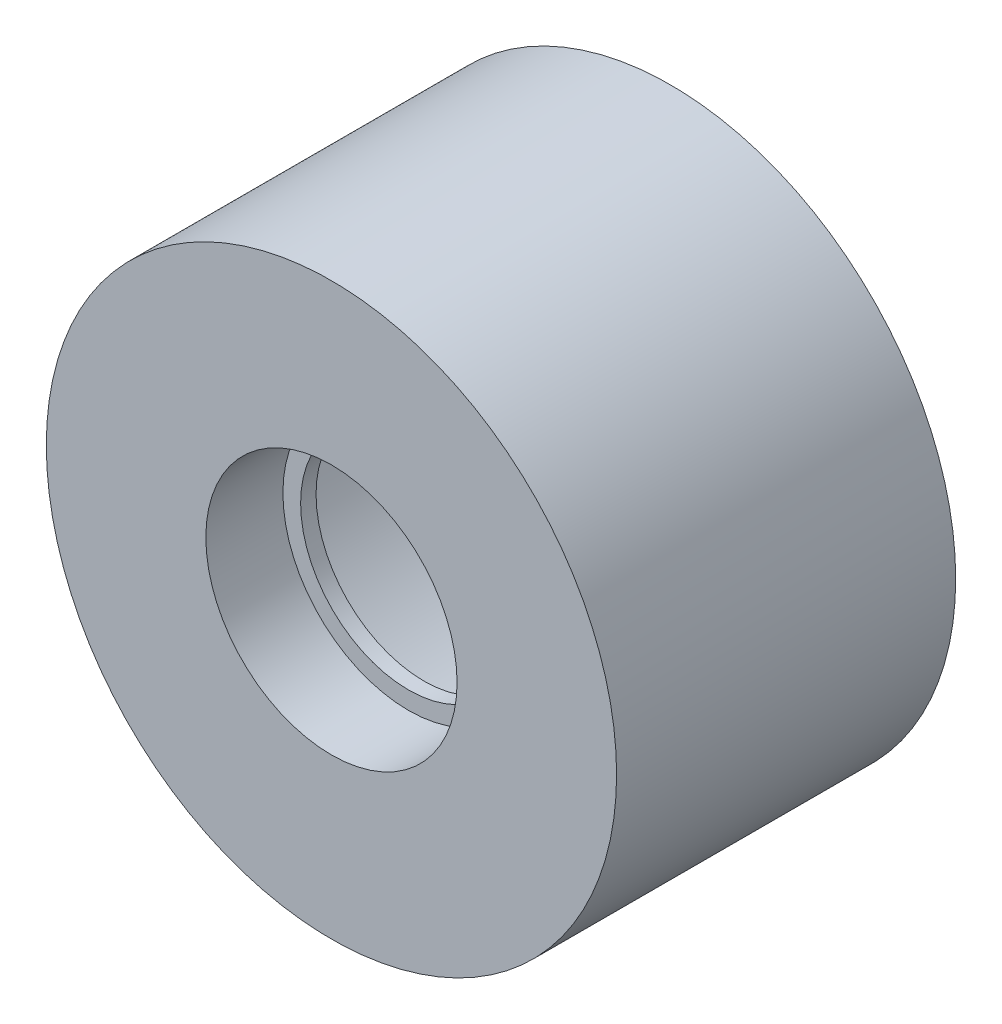
ISO-10303-21;
HEADER;
FILE_DESCRIPTION(('STEP AP214'),'2;1');
FILE_NAME('part.step','',(''),(''),'','','');
FILE_SCHEMA(('AUTOMOTIVE_DESIGN { 1 0 10303 214 1 1 1 1 }'));
ENDSEC;
DATA;
#1=APPLICATION_CONTEXT('core data for automotive mechanical design processes');
#2=APPLICATION_PROTOCOL_DEFINITION('international standard','automotive_design',2000,#1);
#3=PRODUCT_CONTEXT('',#1,'mechanical');
#4=PRODUCT('Part','Part','',(#3));
#5=PRODUCT_RELATED_PRODUCT_CATEGORY('part','',(#4));
#6=PRODUCT_DEFINITION_FORMATION('','',#4);
#7=PRODUCT_DEFINITION_CONTEXT('part definition',#1,'design');
#8=PRODUCT_DEFINITION('design','',#6,#7);
#9=PRODUCT_DEFINITION_SHAPE('','',#8);
#10=(LENGTH_UNIT() NAMED_UNIT(*) SI_UNIT(.MILLI.,.METRE.));
#11=(NAMED_UNIT(*) PLANE_ANGLE_UNIT() SI_UNIT($,.RADIAN.));
#12=(NAMED_UNIT(*) SI_UNIT($,.STERADIAN.) SOLID_ANGLE_UNIT());
#13=UNCERTAINTY_MEASURE_WITH_UNIT(LENGTH_MEASURE(1.E-05),#10,'distance_accuracy_value','');
#14=(GEOMETRIC_REPRESENTATION_CONTEXT(3) GLOBAL_UNCERTAINTY_ASSIGNED_CONTEXT((#13)) GLOBAL_UNIT_ASSIGNED_CONTEXT((#10,
#11,#12)) REPRESENTATION_CONTEXT('',''));
#15=CARTESIAN_POINT('',(0.,0.,0.));
#16=DIRECTION('',(0.,0.,1.));
#17=DIRECTION('',(1.,0.,0.));
#18=AXIS2_PLACEMENT_3D('',#15,#16,#17);
#19=CARTESIAN_POINT('',(0.,0.,22.));
#20=DIRECTION('',(0.,0.,-1.));
#21=DIRECTION('',(-1.,0.,0.));
#22=AXIS2_PLACEMENT_3D('',#19,#20,#21);
#23=CYLINDRICAL_SURFACE('',#22,16.15);
#24=CARTESIAN_POINT('',(0.,0.,16.));
#25=DIRECTION('',(0.,0.,-1.));
#26=DIRECTION('',(-1.,0.,0.));
#27=AXIS2_PLACEMENT_3D('',#24,#25,#26);
#28=CIRCLE('',#27,16.15);
#29=CARTESIAN_POINT('',(-16.15,0.,16.));
#30=VERTEX_POINT('',#29);
#31=EDGE_CURVE('E10',#30,#30,#28,.T.);
#32=ORIENTED_EDGE('',*,*,#31,.F.);
#33=EDGE_LOOP('',(#32));
#34=FACE_BOUND('',#33,.T.);
#35=CARTESIAN_POINT('',(0.,0.,0.));
#36=DIRECTION('',(0.,0.,1.));
#37=DIRECTION('',(1.,0.,0.));
#38=AXIS2_PLACEMENT_3D('',#35,#36,#37);
#39=CIRCLE('',#38,16.15);
#40=CARTESIAN_POINT('',(16.15,0.,0.));
#41=VERTEX_POINT('',#40);
#42=EDGE_CURVE('E62',#41,#41,#39,.T.);
#43=ORIENTED_EDGE('',*,*,#42,.F.);
#44=EDGE_LOOP('',(#43));
#45=FACE_BOUND('',#44,.T.);
#46=ADVANCED_FACE('F43',(#34,#45),#23,.F.);
#47=CARTESIAN_POINT('',(0.,0.,22.));
#48=DIRECTION('',(0.,0.,1.));
#49=DIRECTION('',(1.,0.,0.));
#50=AXIS2_PLACEMENT_3D('',#47,#48,#49);
#51=PLANE('',#50);
#52=CARTESIAN_POINT('',(0.,0.,22.));
#53=DIRECTION('',(0.,0.,1.));
#54=DIRECTION('',(1.,0.,0.));
#55=AXIS2_PLACEMENT_3D('',#52,#53,#54);
#56=CIRCLE('',#55,18.5);
#57=CARTESIAN_POINT('',(18.5,0.,22.));
#58=VERTEX_POINT('',#57);
#59=EDGE_CURVE('E51',#58,#58,#56,.T.);
#60=ORIENTED_EDGE('',*,*,#59,.T.);
#61=EDGE_LOOP('',(#60));
#62=FACE_BOUND('',#61,.T.);
#63=CARTESIAN_POINT('',(0.,0.,22.));
#64=DIRECTION('',(0.,0.,1.));
#65=DIRECTION('',(1.,0.,0.));
#66=AXIS2_PLACEMENT_3D('',#63,#64,#65);
#67=CIRCLE('',#66,8.15);
#68=CARTESIAN_POINT('',(8.15,0.,22.));
#69=VERTEX_POINT('',#68);
#70=EDGE_CURVE('E68',#69,#69,#67,.T.);
#71=ORIENTED_EDGE('',*,*,#70,.F.);
#72=EDGE_LOOP('',(#71));
#73=FACE_BOUND('',#72,.T.);
#74=ADVANCED_FACE('F100',(#62,#73),#51,.T.);
#75=CARTESIAN_POINT('',(0.,0.,0.));
#76=DIRECTION('',(0.,0.,1.));
#77=DIRECTION('',(1.,0.,0.));
#78=AXIS2_PLACEMENT_3D('',#75,#76,#77);
#79=PLANE('',#78);
#80=CARTESIAN_POINT('',(0.,0.,0.));
#81=DIRECTION('',(0.,0.,1.));
#82=DIRECTION('',(1.,0.,0.));
#83=AXIS2_PLACEMENT_3D('',#80,#81,#82);
#84=CIRCLE('',#83,18.5);
#85=CARTESIAN_POINT('',(18.5,0.,0.));
#86=VERTEX_POINT('',#85);
#87=EDGE_CURVE('E56',#86,#86,#84,.T.);
#88=ORIENTED_EDGE('',*,*,#87,.F.);
#89=EDGE_LOOP('',(#88));
#90=FACE_BOUND('',#89,.T.);
#91=ORIENTED_EDGE('',*,*,#42,.T.);
#92=EDGE_LOOP('',(#91));
#93=FACE_BOUND('',#92,.T.);
#94=ADVANCED_FACE('F107',(#90,#93),#79,.F.);
#95=CARTESIAN_POINT('',(0.,0.,22.));
#96=DIRECTION('',(0.,0.,-1.));
#97=DIRECTION('',(-1.,0.,0.));
#98=AXIS2_PLACEMENT_3D('',#95,#96,#97);
#99=CYLINDRICAL_SURFACE('',#98,18.5);
#100=ORIENTED_EDGE('',*,*,#59,.F.);
#101=EDGE_LOOP('',(#100));
#102=FACE_BOUND('',#101,.T.);
#103=ORIENTED_EDGE('',*,*,#87,.T.);
#104=EDGE_LOOP('',(#103));
#105=FACE_BOUND('',#104,.T.);
#106=ADVANCED_FACE('F45',(#102,#105),#99,.T.);
#107=CARTESIAN_POINT('',(0.,0.,17.));
#108=DIRECTION('',(0.,0.,1.));
#109=DIRECTION('',(1.,0.,0.));
#110=AXIS2_PLACEMENT_3D('',#107,#108,#109);
#111=CYLINDRICAL_SURFACE('',#110,8.15);
#112=CARTESIAN_POINT('',(0.,0.,17.));
#113=DIRECTION('',(0.,0.,1.));
#114=DIRECTION('',(1.,0.,0.));
#115=AXIS2_PLACEMENT_3D('',#112,#113,#114);
#116=CIRCLE('',#115,8.15);
#117=CARTESIAN_POINT('',(8.15,0.,17.));
#118=VERTEX_POINT('',#117);
#119=EDGE_CURVE('E67',#118,#118,#116,.T.);
#120=ORIENTED_EDGE('',*,*,#119,.F.);
#121=EDGE_LOOP('',(#120));
#122=FACE_BOUND('',#121,.T.);
#123=ORIENTED_EDGE('',*,*,#70,.T.);
#124=EDGE_LOOP('',(#123));
#125=FACE_BOUND('',#124,.T.);
#126=ADVANCED_FACE('F96',(#122,#125),#111,.F.);
#127=CARTESIAN_POINT('',(0.,0.,17.));
#128=DIRECTION('',(0.,0.,-1.));
#129=DIRECTION('',(-1.,0.,0.));
#130=AXIS2_PLACEMENT_3D('',#127,#128,#129);
#131=PLANE('',#130);
#132=CARTESIAN_POINT('',(0.,0.,17.));
#133=DIRECTION('',(0.,0.,-1.));
#134=DIRECTION('',(-1.,0.,0.));
#135=AXIS2_PLACEMENT_3D('',#132,#133,#134);
#136=CIRCLE('',#135,7.);
#137=CARTESIAN_POINT('',(-7.,0.,17.));
#138=VERTEX_POINT('',#137);
#139=EDGE_CURVE('E76',#138,#138,#136,.T.);
#140=ORIENTED_EDGE('',*,*,#139,.T.);
#141=EDGE_LOOP('',(#140));
#142=FACE_BOUND('',#141,.T.);
#143=ORIENTED_EDGE('',*,*,#119,.T.);
#144=EDGE_LOOP('',(#143));
#145=FACE_BOUND('',#144,.T.);
#146=ADVANCED_FACE('F89',(#142,#145),#131,.F.);
#147=CARTESIAN_POINT('',(0.,0.,16.));
#148=DIRECTION('',(0.,0.,-1.));
#149=DIRECTION('',(-1.,0.,0.));
#150=AXIS2_PLACEMENT_3D('',#147,#148,#149);
#151=PLANE('',#150);
#152=ORIENTED_EDGE('',*,*,#31,.T.);
#153=EDGE_LOOP('',(#152));
#154=FACE_BOUND('',#153,.T.);
#155=CARTESIAN_POINT('',(0.,0.,16.));
#156=DIRECTION('',(0.,0.,-1.));
#157=DIRECTION('',(-1.,0.,0.));
#158=AXIS2_PLACEMENT_3D('',#155,#156,#157);
#159=CIRCLE('',#158,7.);
#160=CARTESIAN_POINT('',(-7.,0.,16.));
#161=VERTEX_POINT('',#160);
#162=EDGE_CURVE('E72',#161,#161,#159,.T.);
#163=ORIENTED_EDGE('',*,*,#162,.F.);
#164=EDGE_LOOP('',(#163));
#165=FACE_BOUND('',#164,.T.);
#166=ADVANCED_FACE('F87',(#154,#165),#151,.T.);
#167=CARTESIAN_POINT('',(0.,0.,16.));
#168=DIRECTION('',(0.,0.,1.));
#169=DIRECTION('',(1.,0.,0.));
#170=AXIS2_PLACEMENT_3D('',#167,#168,#169);
#171=CYLINDRICAL_SURFACE('',#170,7.);
#172=ORIENTED_EDGE('',*,*,#162,.T.);
#173=EDGE_LOOP('',(#172));
#174=FACE_BOUND('',#173,.T.);
#175=ORIENTED_EDGE('',*,*,#139,.F.);
#176=EDGE_LOOP('',(#175));
#177=FACE_BOUND('',#176,.T.);
#178=ADVANCED_FACE('F84',(#174,#177),#171,.F.);
#179=CLOSED_SHELL('',(#46,#74,#94,#106,#126,#146,#166,#178));
#180=MANIFOLD_SOLID_BREP('B2',#179);
#181=ADVANCED_BREP_SHAPE_REPRESENTATION('',(#18,#180),#14);
#182=SHAPE_DEFINITION_REPRESENTATION(#9,#181);
ENDSEC;
END-ISO-10303-21;
